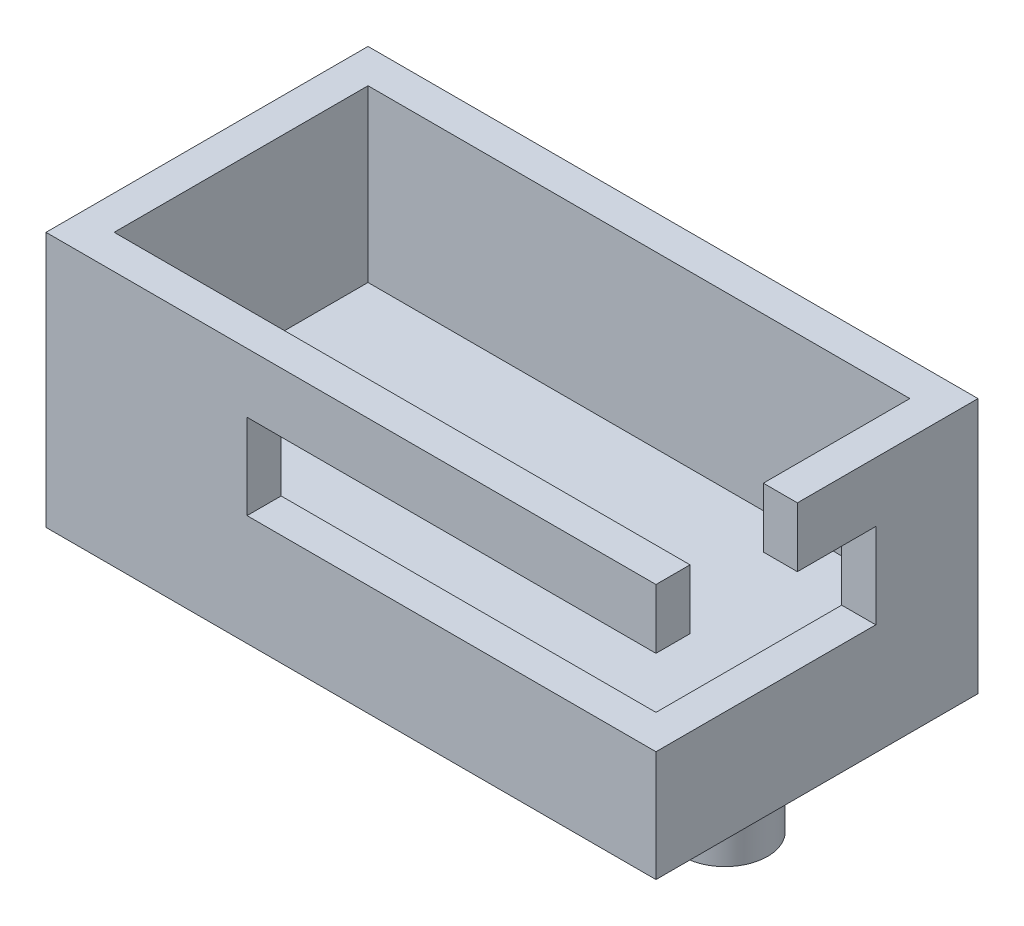
ISO-10303-21;
HEADER;
FILE_DESCRIPTION(('STEP AP214'),'2;1');
FILE_NAME('part.step','',(''),(''),'','','');
FILE_SCHEMA(('AUTOMOTIVE_DESIGN { 1 0 10303 214 1 1 1 1 }'));
ENDSEC;
DATA;
#1=APPLICATION_CONTEXT('core data for automotive mechanical design processes');
#2=APPLICATION_PROTOCOL_DEFINITION('international standard','automotive_design',2000,#1);
#3=PRODUCT_CONTEXT('',#1,'mechanical');
#4=PRODUCT('Part','Part','',(#3));
#5=PRODUCT_RELATED_PRODUCT_CATEGORY('part','',(#4));
#6=PRODUCT_DEFINITION_FORMATION('','',#4);
#7=PRODUCT_DEFINITION_CONTEXT('part definition',#1,'design');
#8=PRODUCT_DEFINITION('design','',#6,#7);
#9=PRODUCT_DEFINITION_SHAPE('','',#8);
#10=(LENGTH_UNIT() NAMED_UNIT(*) SI_UNIT(.MILLI.,.METRE.));
#11=(NAMED_UNIT(*) PLANE_ANGLE_UNIT() SI_UNIT($,.RADIAN.));
#12=(NAMED_UNIT(*) SI_UNIT($,.STERADIAN.) SOLID_ANGLE_UNIT());
#13=UNCERTAINTY_MEASURE_WITH_UNIT(LENGTH_MEASURE(1.E-05),#10,'distance_accuracy_value','');
#14=(GEOMETRIC_REPRESENTATION_CONTEXT(3) GLOBAL_UNCERTAINTY_ASSIGNED_CONTEXT((#13)) GLOBAL_UNIT_ASSIGNED_CONTEXT((#10,
#11,#12)) REPRESENTATION_CONTEXT('',''));
#15=CARTESIAN_POINT('',(0.,0.,0.));
#16=DIRECTION('',(0.,0.,1.));
#17=DIRECTION('',(1.,0.,0.));
#18=AXIS2_PLACEMENT_3D('',#15,#16,#17);
#19=CARTESIAN_POINT('',(33.8,10.,2.));
#20=DIRECTION('',(-1.,0.,0.));
#21=DIRECTION('',(0.,0.,1.));
#22=AXIS2_PLACEMENT_3D('',#19,#20,#21);
#23=PLANE('',#22);
#24=DIRECTION('',(0.,0.,-1.));
#25=VECTOR('',#24,1.);
#26=CARTESIAN_POINT('',(33.8,10.,2.));
#27=LINE('',#26,#25);
#28=CARTESIAN_POINT('',(33.8,10.,-6.30000000000001));
#29=VERTEX_POINT('',#28);
#30=CARTESIAN_POINT('',(33.8,10.,-16.9));
#31=VERTEX_POINT('',#30);
#32=EDGE_CURVE('E187',#29,#31,#27,.T.);
#33=ORIENTED_EDGE('',*,*,#32,.F.);
#34=DIRECTION('',(0.,1.,0.));
#35=VECTOR('',#34,1.);
#36=CARTESIAN_POINT('',(33.8,6.5,-6.30000000000001));
#37=LINE('',#36,#35);
#38=CARTESIAN_POINT('',(33.8,6.5,-6.30000000000001));
#39=VERTEX_POINT('',#38);
#40=EDGE_CURVE('E178',#39,#29,#37,.T.);
#41=ORIENTED_EDGE('',*,*,#40,.F.);
#42=DIRECTION('',(0.,0.,1.));
#43=VECTOR('',#42,1.);
#44=CARTESIAN_POINT('',(33.8,6.5,-41.4153013442625));
#45=LINE('',#44,#43);
#46=CARTESIAN_POINT('',(33.8,6.5,-10.9));
#47=VERTEX_POINT('',#46);
#48=EDGE_CURVE('E266',#47,#39,#45,.T.);
#49=ORIENTED_EDGE('',*,*,#48,.F.);
#50=DIRECTION('',(0.,-1.,0.));
#51=VECTOR('',#50,1.);
#52=CARTESIAN_POINT('',(33.8,6.5,-10.9));
#53=LINE('',#52,#51);
#54=CARTESIAN_POINT('',(33.8,1.5,-10.9));
#55=VERTEX_POINT('',#54);
#56=EDGE_CURVE('E250',#47,#55,#53,.T.);
#57=ORIENTED_EDGE('',*,*,#56,.T.);
#58=DIRECTION('',(0.,0.,1.));
#59=VECTOR('',#58,1.);
#60=CARTESIAN_POINT('',(33.8,1.5,-41.4153013442625));
#61=LINE('',#60,#59);
#62=CARTESIAN_POINT('',(33.8,1.5,2.));
#63=VERTEX_POINT('',#62);
#64=EDGE_CURVE('E269',#55,#63,#61,.T.);
#65=ORIENTED_EDGE('',*,*,#64,.T.);
#66=DIRECTION('',(0.,-1.,0.));
#67=VECTOR('',#66,1.);
#68=CARTESIAN_POINT('',(33.8,10.,2.));
#69=LINE('',#68,#67);
#70=CARTESIAN_POINT('',(33.8,-5.,2.));
#71=VERTEX_POINT('',#70);
#72=EDGE_CURVE('E201',#63,#71,#69,.T.);
#73=ORIENTED_EDGE('',*,*,#72,.T.);
#74=DIRECTION('',(0.,0.,-1.));
#75=VECTOR('',#74,1.);
#76=CARTESIAN_POINT('',(33.8,-5.,0.));
#77=LINE('',#76,#75);
#78=CARTESIAN_POINT('',(33.8,-5.,-16.9));
#79=VERTEX_POINT('',#78);
#80=EDGE_CURVE('E284',#71,#79,#77,.T.);
#81=ORIENTED_EDGE('',*,*,#80,.T.);
#82=DIRECTION('',(0.,-1.,0.));
#83=VECTOR('',#82,1.);
#84=CARTESIAN_POINT('',(33.8,10.,-16.9));
#85=LINE('',#84,#83);
#86=EDGE_CURVE('E199',#31,#79,#85,.T.);
#87=ORIENTED_EDGE('',*,*,#86,.F.);
#88=EDGE_LOOP('',(#33,#41,#49,#57,#65,#73,#81,#87));
#89=FACE_BOUND('',#88,.T.);
#90=ADVANCED_FACE('F45',(#89),#23,.F.);
#91=CARTESIAN_POINT('',(9.8,6.5,-41.4153013442625));
#92=DIRECTION('',(0.,1.,0.));
#93=DIRECTION('',(-1.,0.,0.));
#94=AXIS2_PLACEMENT_3D('',#91,#92,#93);
#95=PLANE('',#94);
#96=ORIENTED_EDGE('',*,*,#48,.T.);
#97=DIRECTION('',(1.,0.,0.));
#98=VECTOR('',#97,1.);
#99=CARTESIAN_POINT('',(24.5930589013091,6.5,-6.30000000000001));
#100=LINE('',#99,#98);
#101=CARTESIAN_POINT('',(31.8,6.5,-6.30000000000001));
#102=VERTEX_POINT('',#101);
#103=EDGE_CURVE('E243',#102,#39,#100,.T.);
#104=ORIENTED_EDGE('',*,*,#103,.F.);
#105=DIRECTION('',(0.,0.,-1.));
#106=VECTOR('',#105,1.);
#107=CARTESIAN_POINT('',(31.8,6.5,0.));
#108=LINE('',#107,#106);
#109=CARTESIAN_POINT('',(31.8,6.5,-10.9));
#110=VERTEX_POINT('',#109);
#111=EDGE_CURVE('E209',#102,#110,#108,.T.);
#112=ORIENTED_EDGE('',*,*,#111,.T.);
#113=DIRECTION('',(1.,0.,0.));
#114=VECTOR('',#113,1.);
#115=CARTESIAN_POINT('',(9.8,6.5,-10.9));
#116=LINE('',#115,#114);
#117=EDGE_CURVE('E253',#110,#47,#116,.T.);
#118=ORIENTED_EDGE('',*,*,#117,.T.);
#119=EDGE_LOOP('',(#96,#104,#112,#118));
#120=FACE_BOUND('',#119,.T.);
#121=ADVANCED_FACE('F331',(#120),#95,.F.);
#122=CARTESIAN_POINT('',(0.,10.,0.));
#123=DIRECTION('',(0.,1.,0.));
#124=DIRECTION('',(0.,0.,1.));
#125=AXIS2_PLACEMENT_3D('',#122,#123,#124);
#126=PLANE('',#125);
#127=DIRECTION('',(1.,0.,0.));
#128=VECTOR('',#127,1.);
#129=CARTESIAN_POINT('',(24.5930589013091,10.,-6.30000000000001));
#130=LINE('',#129,#128);
#131=CARTESIAN_POINT('',(31.8,10.,-6.30000000000001));
#132=VERTEX_POINT('',#131);
#133=EDGE_CURVE('E246',#132,#29,#130,.T.);
#134=ORIENTED_EDGE('',*,*,#133,.T.);
#135=ORIENTED_EDGE('',*,*,#32,.T.);
#136=DIRECTION('',(-1.,0.,0.));
#137=VECTOR('',#136,1.);
#138=CARTESIAN_POINT('',(-2.,10.,-16.9));
#139=LINE('',#138,#137);
#140=CARTESIAN_POINT('',(-2.,10.,-16.9));
#141=VERTEX_POINT('',#140);
#142=EDGE_CURVE('E186',#31,#141,#139,.T.);
#143=ORIENTED_EDGE('',*,*,#142,.T.);
#144=DIRECTION('',(0.,0.,1.));
#145=VECTOR('',#144,1.);
#146=CARTESIAN_POINT('',(-2.,10.,2.));
#147=LINE('',#146,#145);
#148=CARTESIAN_POINT('',(-2.,10.,2.));
#149=VERTEX_POINT('',#148);
#150=EDGE_CURVE('E189',#141,#149,#147,.T.);
#151=ORIENTED_EDGE('',*,*,#150,.T.);
#152=DIRECTION('',(1.,0.,0.));
#153=VECTOR('',#152,1.);
#154=CARTESIAN_POINT('',(-2.,10.,2.));
#155=LINE('',#154,#153);
#156=CARTESIAN_POINT('',(33.8,10.,2.));
#157=VERTEX_POINT('',#156);
#158=EDGE_CURVE('E184',#149,#157,#155,.T.);
#159=ORIENTED_EDGE('',*,*,#158,.T.);
#160=CARTESIAN_POINT('',(33.8,10.,0.));
#161=VERTEX_POINT('',#160);
#162=EDGE_CURVE('E175',#157,#161,#27,.T.);
#163=ORIENTED_EDGE('',*,*,#162,.T.);
#164=DIRECTION('',(1.,0.,0.));
#165=VECTOR('',#164,1.);
#166=CARTESIAN_POINT('',(0.,10.,0.));
#167=LINE('',#166,#165);
#168=CARTESIAN_POINT('',(0.,10.,0.));
#169=VERTEX_POINT('',#168);
#170=EDGE_CURVE('E159',#169,#161,#167,.T.);
#171=ORIENTED_EDGE('',*,*,#170,.F.);
#172=DIRECTION('',(0.,0.,1.));
#173=VECTOR('',#172,1.);
#174=CARTESIAN_POINT('',(0.,10.,0.));
#175=LINE('',#174,#173);
#176=CARTESIAN_POINT('',(0.,10.,-14.9));
#177=VERTEX_POINT('',#176);
#178=EDGE_CURVE('E170',#177,#169,#175,.T.);
#179=ORIENTED_EDGE('',*,*,#178,.F.);
#180=DIRECTION('',(-1.,0.,0.));
#181=VECTOR('',#180,1.);
#182=CARTESIAN_POINT('',(0.,10.,-14.9));
#183=LINE('',#182,#181);
#184=CARTESIAN_POINT('',(31.8,10.,-14.9));
#185=VERTEX_POINT('',#184);
#186=EDGE_CURVE('E294',#185,#177,#183,.T.);
#187=ORIENTED_EDGE('',*,*,#186,.F.);
#188=DIRECTION('',(0.,0.,-1.));
#189=VECTOR('',#188,1.);
#190=CARTESIAN_POINT('',(31.8,10.,0.));
#191=LINE('',#190,#189);
#192=EDGE_CURVE('E169',#132,#185,#191,.T.);
#193=ORIENTED_EDGE('',*,*,#192,.F.);
#194=EDGE_LOOP('',(#134,#135,#143,#151,#159,#163,#171,#179,#187,#193));
#195=FACE_BOUND('',#194,.T.);
#196=ADVANCED_FACE('F182',(#195),#126,.T.);
#197=CARTESIAN_POINT('',(-2.,10.,2.));
#198=DIRECTION('',(0.,0.,-1.));
#199=DIRECTION('',(-1.,0.,0.));
#200=AXIS2_PLACEMENT_3D('',#197,#198,#199);
#201=PLANE('',#200);
#202=DIRECTION('',(0.,-1.,0.));
#203=VECTOR('',#202,1.);
#204=CARTESIAN_POINT('',(9.8,6.5,2.));
#205=LINE('',#204,#203);
#206=CARTESIAN_POINT('',(9.8,6.5,2.));
#207=VERTEX_POINT('',#206);
#208=CARTESIAN_POINT('',(9.8,1.5,2.));
#209=VERTEX_POINT('',#208);
#210=EDGE_CURVE('E248',#207,#209,#205,.T.);
#211=ORIENTED_EDGE('',*,*,#210,.F.);
#212=DIRECTION('',(-1.,0.,0.));
#213=VECTOR('',#212,1.);
#214=CARTESIAN_POINT('',(9.8,6.5,2.));
#215=LINE('',#214,#213);
#216=CARTESIAN_POINT('',(33.8,6.5,2.));
#217=VERTEX_POINT('',#216);
#218=EDGE_CURVE('E261',#217,#207,#215,.T.);
#219=ORIENTED_EDGE('',*,*,#218,.F.);
#220=EDGE_CURVE('E202',#157,#217,#69,.T.);
#221=ORIENTED_EDGE('',*,*,#220,.F.);
#222=ORIENTED_EDGE('',*,*,#158,.F.);
#223=DIRECTION('',(0.,-1.,0.));
#224=VECTOR('',#223,1.);
#225=CARTESIAN_POINT('',(-2.,10.,2.));
#226=LINE('',#225,#224);
#227=CARTESIAN_POINT('',(-2.,-5.,2.));
#228=VERTEX_POINT('',#227);
#229=EDGE_CURVE('E195',#149,#228,#226,.T.);
#230=ORIENTED_EDGE('',*,*,#229,.T.);
#231=DIRECTION('',(1.,0.,0.));
#232=VECTOR('',#231,1.);
#233=CARTESIAN_POINT('',(0.,-5.,2.));
#234=LINE('',#233,#232);
#235=EDGE_CURVE('E281',#228,#71,#234,.T.);
#236=ORIENTED_EDGE('',*,*,#235,.T.);
#237=ORIENTED_EDGE('',*,*,#72,.F.);
#238=DIRECTION('',(1.,0.,0.));
#239=VECTOR('',#238,1.);
#240=CARTESIAN_POINT('',(9.8,1.5,2.));
#241=LINE('',#240,#239);
#242=EDGE_CURVE('E259',#209,#63,#241,.T.);
#243=ORIENTED_EDGE('',*,*,#242,.F.);
#244=EDGE_LOOP('',(#211,#219,#221,#222,#230,#236,#237,#243));
#245=FACE_BOUND('',#244,.T.);
#246=ADVANCED_FACE('F365',(#245),#201,.F.);
#247=CARTESIAN_POINT('',(33.8,6.5,0.));
#248=VERTEX_POINT('',#247);
#249=EDGE_CURVE('E177',#248,#217,#45,.T.);
#250=ORIENTED_EDGE('',*,*,#249,.F.);
#251=DIRECTION('',(0.,-1.,0.));
#252=VECTOR('',#251,1.);
#253=CARTESIAN_POINT('',(33.8,6.5,0.));
#254=LINE('',#253,#252);
#255=EDGE_CURVE('E162',#161,#248,#254,.T.);
#256=ORIENTED_EDGE('',*,*,#255,.F.);
#257=ORIENTED_EDGE('',*,*,#162,.F.);
#258=ORIENTED_EDGE('',*,*,#220,.T.);
#259=EDGE_LOOP('',(#250,#256,#257,#258));
#260=FACE_BOUND('',#259,.T.);
#261=ADVANCED_FACE('F173',(#260),#23,.F.);
#262=CARTESIAN_POINT('',(-2.,10.,-16.9));
#263=DIRECTION('',(0.,0.,1.));
#264=DIRECTION('',(1.,0.,0.));
#265=AXIS2_PLACEMENT_3D('',#262,#263,#264);
#266=PLANE('',#265);
#267=ORIENTED_EDGE('',*,*,#86,.T.);
#268=DIRECTION('',(1.,0.,0.));
#269=VECTOR('',#268,1.);
#270=CARTESIAN_POINT('',(0.,-5.,-16.9));
#271=LINE('',#270,#269);
#272=CARTESIAN_POINT('',(-2.,-5.,-16.9));
#273=VERTEX_POINT('',#272);
#274=EDGE_CURVE('E287',#273,#79,#271,.T.);
#275=ORIENTED_EDGE('',*,*,#274,.F.);
#276=DIRECTION('',(0.,-1.,0.));
#277=VECTOR('',#276,1.);
#278=CARTESIAN_POINT('',(-2.,10.,-16.9));
#279=LINE('',#278,#277);
#280=EDGE_CURVE('E197',#141,#273,#279,.T.);
#281=ORIENTED_EDGE('',*,*,#280,.F.);
#282=ORIENTED_EDGE('',*,*,#142,.F.);
#283=EDGE_LOOP('',(#267,#275,#281,#282));
#284=FACE_BOUND('',#283,.T.);
#285=ADVANCED_FACE('F364',(#284),#266,.F.);
#286=CARTESIAN_POINT('',(-2.,10.,2.));
#287=DIRECTION('',(1.,0.,0.));
#288=DIRECTION('',(0.,0.,-1.));
#289=AXIS2_PLACEMENT_3D('',#286,#287,#288);
#290=PLANE('',#289);
#291=ORIENTED_EDGE('',*,*,#280,.T.);
#292=DIRECTION('',(0.,0.,-1.));
#293=VECTOR('',#292,1.);
#294=CARTESIAN_POINT('',(-2.,-5.,0.));
#295=LINE('',#294,#293);
#296=EDGE_CURVE('E278',#228,#273,#295,.T.);
#297=ORIENTED_EDGE('',*,*,#296,.F.);
#298=ORIENTED_EDGE('',*,*,#229,.F.);
#299=ORIENTED_EDGE('',*,*,#150,.F.);
#300=EDGE_LOOP('',(#291,#297,#298,#299));
#301=FACE_BOUND('',#300,.T.);
#302=ADVANCED_FACE('F371',(#301),#290,.F.);
#303=CARTESIAN_POINT('',(0.,10.,0.));
#304=DIRECTION('',(1.,0.,0.));
#305=DIRECTION('',(0.,0.,-1.));
#306=AXIS2_PLACEMENT_3D('',#303,#304,#305);
#307=PLANE('',#306);
#308=DIRECTION('',(0.,0.,1.));
#309=VECTOR('',#308,1.);
#310=CARTESIAN_POINT('',(0.,0.,0.));
#311=LINE('',#310,#309);
#312=CARTESIAN_POINT('',(0.,0.,-14.9));
#313=VERTEX_POINT('',#312);
#314=CARTESIAN_POINT('',(0.,0.,0.));
#315=VERTEX_POINT('',#314);
#316=EDGE_CURVE('E290',#313,#315,#311,.T.);
#317=ORIENTED_EDGE('',*,*,#316,.F.);
#318=DIRECTION('',(0.,-1.,0.));
#319=VECTOR('',#318,1.);
#320=CARTESIAN_POINT('',(0.,10.,-14.9));
#321=LINE('',#320,#319);
#322=EDGE_CURVE('E296',#177,#313,#321,.T.);
#323=ORIENTED_EDGE('',*,*,#322,.F.);
#324=ORIENTED_EDGE('',*,*,#178,.T.);
#325=DIRECTION('',(0.,-1.,0.));
#326=VECTOR('',#325,1.);
#327=CARTESIAN_POINT('',(0.,10.,0.));
#328=LINE('',#327,#326);
#329=EDGE_CURVE('E165',#169,#315,#328,.T.);
#330=ORIENTED_EDGE('',*,*,#329,.T.);
#331=EDGE_LOOP('',(#317,#323,#324,#330));
#332=FACE_BOUND('',#331,.T.);
#333=ADVANCED_FACE('F313',(#332),#307,.T.);
#334=CARTESIAN_POINT('',(0.,10.,0.));
#335=DIRECTION('',(0.,0.,-1.));
#336=DIRECTION('',(-1.,0.,0.));
#337=AXIS2_PLACEMENT_3D('',#334,#335,#336);
#338=PLANE('',#337);
#339=DIRECTION('',(1.,0.,0.));
#340=VECTOR('',#339,1.);
#341=CARTESIAN_POINT('',(0.,6.5,0.));
#342=LINE('',#341,#340);
#343=CARTESIAN_POINT('',(9.8,6.5,0.));
#344=VERTEX_POINT('',#343);
#345=EDGE_CURVE('E60',#344,#248,#342,.T.);
#346=ORIENTED_EDGE('',*,*,#345,.F.);
#347=DIRECTION('',(0.,1.,0.));
#348=VECTOR('',#347,1.);
#349=CARTESIAN_POINT('',(9.8,10.,0.));
#350=LINE('',#349,#348);
#351=CARTESIAN_POINT('',(9.8,1.5,0.));
#352=VERTEX_POINT('',#351);
#353=EDGE_CURVE('E211',#352,#344,#350,.T.);
#354=ORIENTED_EDGE('',*,*,#353,.F.);
#355=DIRECTION('',(-1.,0.,0.));
#356=VECTOR('',#355,1.);
#357=CARTESIAN_POINT('',(0.,1.5,0.));
#358=LINE('',#357,#356);
#359=CARTESIAN_POINT('',(31.8,1.5,0.));
#360=VERTEX_POINT('',#359);
#361=EDGE_CURVE('E275',#360,#352,#358,.T.);
#362=ORIENTED_EDGE('',*,*,#361,.F.);
#363=DIRECTION('',(0.,-1.,0.));
#364=VECTOR('',#363,1.);
#365=CARTESIAN_POINT('',(31.8,10.,0.));
#366=LINE('',#365,#364);
#367=CARTESIAN_POINT('',(31.8,0.,0.));
#368=VERTEX_POINT('',#367);
#369=EDGE_CURVE('E310',#360,#368,#366,.T.);
#370=ORIENTED_EDGE('',*,*,#369,.T.);
#371=DIRECTION('',(1.,0.,0.));
#372=VECTOR('',#371,1.);
#373=CARTESIAN_POINT('',(0.,0.,0.));
#374=LINE('',#373,#372);
#375=EDGE_CURVE('E299',#315,#368,#374,.T.);
#376=ORIENTED_EDGE('',*,*,#375,.F.);
#377=ORIENTED_EDGE('',*,*,#329,.F.);
#378=ORIENTED_EDGE('',*,*,#170,.T.);
#379=ORIENTED_EDGE('',*,*,#255,.T.);
#380=EDGE_LOOP('',(#346,#354,#362,#370,#376,#377,#378,#379));
#381=FACE_BOUND('',#380,.T.);
#382=ADVANCED_FACE('F161',(#381),#338,.T.);
#383=CARTESIAN_POINT('',(31.8,10.,0.));
#384=DIRECTION('',(-1.,0.,0.));
#385=DIRECTION('',(0.,0.,1.));
#386=AXIS2_PLACEMENT_3D('',#383,#384,#385);
#387=PLANE('',#386);
#388=DIRECTION('',(0.,1.,0.));
#389=VECTOR('',#388,1.);
#390=CARTESIAN_POINT('',(31.8,6.5,-6.30000000000001));
#391=LINE('',#390,#389);
#392=EDGE_CURVE('E68',#102,#132,#391,.T.);
#393=ORIENTED_EDGE('',*,*,#392,.T.);
#394=ORIENTED_EDGE('',*,*,#192,.T.);
#395=DIRECTION('',(0.,-1.,0.));
#396=VECTOR('',#395,1.);
#397=CARTESIAN_POINT('',(31.8,10.,-14.9));
#398=LINE('',#397,#396);
#399=CARTESIAN_POINT('',(31.8,0.,-14.9));
#400=VERTEX_POINT('',#399);
#401=EDGE_CURVE('E308',#185,#400,#398,.T.);
#402=ORIENTED_EDGE('',*,*,#401,.T.);
#403=DIRECTION('',(0.,0.,-1.));
#404=VECTOR('',#403,1.);
#405=CARTESIAN_POINT('',(31.8,0.,0.));
#406=LINE('',#405,#404);
#407=EDGE_CURVE('E302',#368,#400,#406,.T.);
#408=ORIENTED_EDGE('',*,*,#407,.F.);
#409=ORIENTED_EDGE('',*,*,#369,.F.);
#410=DIRECTION('',(0.,0.,1.));
#411=VECTOR('',#410,1.);
#412=CARTESIAN_POINT('',(31.8,1.5,0.));
#413=LINE('',#412,#411);
#414=CARTESIAN_POINT('',(31.8,1.5,-10.9));
#415=VERTEX_POINT('',#414);
#416=EDGE_CURVE('E207',#415,#360,#413,.T.);
#417=ORIENTED_EDGE('',*,*,#416,.F.);
#418=DIRECTION('',(0.,1.,0.));
#419=VECTOR('',#418,1.);
#420=CARTESIAN_POINT('',(31.8,10.,-10.9));
#421=LINE('',#420,#419);
#422=EDGE_CURVE('E204',#415,#110,#421,.T.);
#423=ORIENTED_EDGE('',*,*,#422,.T.);
#424=ORIENTED_EDGE('',*,*,#111,.F.);
#425=EDGE_LOOP('',(#393,#394,#402,#408,#409,#417,#423,#424));
#426=FACE_BOUND('',#425,.T.);
#427=ADVANCED_FACE('F326',(#426),#387,.T.);
#428=CARTESIAN_POINT('',(0.,10.,-14.9));
#429=DIRECTION('',(0.,0.,1.));
#430=DIRECTION('',(1.,0.,0.));
#431=AXIS2_PLACEMENT_3D('',#428,#429,#430);
#432=PLANE('',#431);
#433=DIRECTION('',(-1.,0.,0.));
#434=VECTOR('',#433,1.);
#435=CARTESIAN_POINT('',(0.,0.,-14.9));
#436=LINE('',#435,#434);
#437=EDGE_CURVE('E291',#400,#313,#436,.T.);
#438=ORIENTED_EDGE('',*,*,#437,.F.);
#439=ORIENTED_EDGE('',*,*,#401,.F.);
#440=ORIENTED_EDGE('',*,*,#186,.T.);
#441=ORIENTED_EDGE('',*,*,#322,.T.);
#442=EDGE_LOOP('',(#438,#439,#440,#441));
#443=FACE_BOUND('',#442,.T.);
#444=ADVANCED_FACE('F321',(#443),#432,.T.);
#445=CARTESIAN_POINT('',(0.,0.,0.));
#446=DIRECTION('',(0.,1.,0.));
#447=DIRECTION('',(0.,0.,1.));
#448=AXIS2_PLACEMENT_3D('',#445,#446,#447);
#449=PLANE('',#448);
#450=ORIENTED_EDGE('',*,*,#437,.T.);
#451=ORIENTED_EDGE('',*,*,#316,.T.);
#452=ORIENTED_EDGE('',*,*,#375,.T.);
#453=ORIENTED_EDGE('',*,*,#407,.T.);
#454=EDGE_LOOP('',(#450,#451,#452,#453));
#455=FACE_BOUND('',#454,.T.);
#456=ADVANCED_FACE('F316',(#455),#449,.T.);
#457=CARTESIAN_POINT('',(0.,-5.,0.));
#458=DIRECTION('',(0.,1.,0.));
#459=DIRECTION('',(0.,0.,1.));
#460=AXIS2_PLACEMENT_3D('',#457,#458,#459);
#461=PLANE('',#460);
#462=CARTESIAN_POINT('',(28.4,-5.,-7.44999999999999));
#463=DIRECTION('',(0.,1.,0.));
#464=DIRECTION('',(0.,0.,1.));
#465=AXIS2_PLACEMENT_3D('',#462,#463,#464);
#466=CIRCLE('',#465,2.9);
#467=CARTESIAN_POINT('',(28.4,-5.,-4.55));
#468=VERTEX_POINT('',#467);
#469=EDGE_CURVE('E53',#468,#468,#466,.T.);
#470=ORIENTED_EDGE('',*,*,#469,.T.);
#471=EDGE_LOOP('',(#470));
#472=FACE_BOUND('',#471,.T.);
#473=CARTESIAN_POINT('',(3.4,-5.,-7.45));
#474=DIRECTION('',(0.,1.,0.));
#475=DIRECTION('',(0.,0.,1.));
#476=AXIS2_PLACEMENT_3D('',#473,#474,#475);
#477=CIRCLE('',#476,2.9);
#478=CARTESIAN_POINT('',(3.4,-5.,-4.55));
#479=VERTEX_POINT('',#478);
#480=EDGE_CURVE('E216',#479,#479,#477,.T.);
#481=ORIENTED_EDGE('',*,*,#480,.T.);
#482=EDGE_LOOP('',(#481));
#483=FACE_BOUND('',#482,.T.);
#484=ORIENTED_EDGE('',*,*,#296,.T.);
#485=ORIENTED_EDGE('',*,*,#274,.T.);
#486=ORIENTED_EDGE('',*,*,#80,.F.);
#487=ORIENTED_EDGE('',*,*,#235,.F.);
#488=EDGE_LOOP('',(#484,#485,#486,#487));
#489=FACE_BOUND('',#488,.T.);
#490=ADVANCED_FACE('F221',(#472,#483,#489),#461,.F.);
#491=CARTESIAN_POINT('',(9.8,6.5,-41.4153013442625));
#492=DIRECTION('',(-1.,0.,0.));
#493=DIRECTION('',(0.,-1.,0.));
#494=AXIS2_PLACEMENT_3D('',#491,#492,#493);
#495=PLANE('',#494);
#496=ORIENTED_EDGE('',*,*,#353,.T.);
#497=DIRECTION('',(0.,0.,1.));
#498=VECTOR('',#497,1.);
#499=CARTESIAN_POINT('',(9.8,6.5,-41.4153013442625));
#500=LINE('',#499,#498);
#501=EDGE_CURVE('E254',#344,#207,#500,.T.);
#502=ORIENTED_EDGE('',*,*,#501,.T.);
#503=ORIENTED_EDGE('',*,*,#210,.T.);
#504=DIRECTION('',(0.,0.,1.));
#505=VECTOR('',#504,1.);
#506=CARTESIAN_POINT('',(9.8,1.5,-41.4153013442625));
#507=LINE('',#506,#505);
#508=EDGE_CURVE('E264',#352,#209,#507,.T.);
#509=ORIENTED_EDGE('',*,*,#508,.F.);
#510=EDGE_LOOP('',(#496,#502,#503,#509));
#511=FACE_BOUND('',#510,.T.);
#512=ADVANCED_FACE('F386',(#511),#495,.F.);
#513=ORIENTED_EDGE('',*,*,#345,.T.);
#514=ORIENTED_EDGE('',*,*,#249,.T.);
#515=ORIENTED_EDGE('',*,*,#218,.T.);
#516=ORIENTED_EDGE('',*,*,#501,.F.);
#517=EDGE_LOOP('',(#513,#514,#515,#516));
#518=FACE_BOUND('',#517,.T.);
#519=ADVANCED_FACE('F360',(#518),#95,.F.);
#520=CARTESIAN_POINT('',(9.8,1.5,-41.4153013442625));
#521=DIRECTION('',(0.,-1.,0.));
#522=DIRECTION('',(0.,0.,-1.));
#523=AXIS2_PLACEMENT_3D('',#520,#521,#522);
#524=PLANE('',#523);
#525=ORIENTED_EDGE('',*,*,#361,.T.);
#526=ORIENTED_EDGE('',*,*,#508,.T.);
#527=ORIENTED_EDGE('',*,*,#242,.T.);
#528=ORIENTED_EDGE('',*,*,#64,.F.);
#529=DIRECTION('',(-1.,0.,0.));
#530=VECTOR('',#529,1.);
#531=CARTESIAN_POINT('',(9.8,1.5,-10.9));
#532=LINE('',#531,#530);
#533=EDGE_CURVE('E256',#55,#415,#532,.T.);
#534=ORIENTED_EDGE('',*,*,#533,.T.);
#535=ORIENTED_EDGE('',*,*,#416,.T.);
#536=EDGE_LOOP('',(#525,#526,#527,#528,#534,#535));
#537=FACE_BOUND('',#536,.T.);
#538=ADVANCED_FACE('F352',(#537),#524,.F.);
#539=CARTESIAN_POINT('',(-2.,10.,-10.9));
#540=DIRECTION('',(0.,0.,1.));
#541=DIRECTION('',(1.,0.,0.));
#542=AXIS2_PLACEMENT_3D('',#539,#540,#541);
#543=PLANE('',#542);
#544=ORIENTED_EDGE('',*,*,#533,.F.);
#545=ORIENTED_EDGE('',*,*,#56,.F.);
#546=ORIENTED_EDGE('',*,*,#117,.F.);
#547=ORIENTED_EDGE('',*,*,#422,.F.);
#548=EDGE_LOOP('',(#544,#545,#546,#547));
#549=FACE_BOUND('',#548,.T.);
#550=ADVANCED_FACE('F334',(#549),#543,.T.);
#551=CARTESIAN_POINT('',(24.5930589013091,6.5,-6.30000000000001));
#552=DIRECTION('',(0.,0.,-1.));
#553=DIRECTION('',(-1.,0.,0.));
#554=AXIS2_PLACEMENT_3D('',#551,#552,#553);
#555=PLANE('',#554);
#556=ORIENTED_EDGE('',*,*,#103,.T.);
#557=ORIENTED_EDGE('',*,*,#40,.T.);
#558=ORIENTED_EDGE('',*,*,#133,.F.);
#559=ORIENTED_EDGE('',*,*,#392,.F.);
#560=EDGE_LOOP('',(#556,#557,#558,#559));
#561=FACE_BOUND('',#560,.T.);
#562=ADVANCED_FACE('F340',(#561),#555,.F.);
#563=CARTESIAN_POINT('',(3.4,-10.,-7.45));
#564=DIRECTION('',(0.,1.,0.));
#565=DIRECTION('',(0.,0.,1.));
#566=AXIS2_PLACEMENT_3D('',#563,#564,#565);
#567=CYLINDRICAL_SURFACE('',#566,2.5);
#568=CARTESIAN_POINT('',(3.4,-5.4,-7.45));
#569=DIRECTION('',(0.,1.,0.));
#570=DIRECTION('',(0.,0.,1.));
#571=AXIS2_PLACEMENT_3D('',#568,#569,#570);
#572=CIRCLE('',#571,2.5);
#573=CARTESIAN_POINT('',(3.4,-5.4,-4.95));
#574=VERTEX_POINT('',#573);
#575=EDGE_CURVE('E12',#574,#574,#572,.F.);
#576=ORIENTED_EDGE('',*,*,#575,.T.);
#577=EDGE_LOOP('',(#576));
#578=FACE_BOUND('',#577,.T.);
#579=CARTESIAN_POINT('',(3.4,-10.,-7.45));
#580=DIRECTION('',(0.,-1.,0.));
#581=DIRECTION('',(0.,0.,-1.));
#582=AXIS2_PLACEMENT_3D('',#579,#580,#581);
#583=CIRCLE('',#582,2.5);
#584=CARTESIAN_POINT('',(3.4,-10.,-9.95));
#585=VERTEX_POINT('',#584);
#586=EDGE_CURVE('E179',#585,#585,#583,.T.);
#587=ORIENTED_EDGE('',*,*,#586,.F.);
#588=EDGE_LOOP('',(#587));
#589=FACE_BOUND('',#588,.T.);
#590=ADVANCED_FACE('F342',(#578,#589),#567,.T.);
#591=CARTESIAN_POINT('',(3.4,-10.,-7.45));
#592=DIRECTION('',(0.,-1.,0.));
#593=DIRECTION('',(0.,0.,-1.));
#594=AXIS2_PLACEMENT_3D('',#591,#592,#593);
#595=PLANE('',#594);
#596=ORIENTED_EDGE('',*,*,#586,.T.);
#597=EDGE_LOOP('',(#596));
#598=FACE_BOUND('',#597,.T.);
#599=ADVANCED_FACE('F233',(#598),#595,.T.);
#600=CARTESIAN_POINT('',(28.4,-10.,-7.44999999999999));
#601=DIRECTION('',(0.,1.,0.));
#602=DIRECTION('',(0.,0.,1.));
#603=AXIS2_PLACEMENT_3D('',#600,#601,#602);
#604=CYLINDRICAL_SURFACE('',#603,2.5);
#605=CARTESIAN_POINT('',(28.4,-5.4,-7.44999999999999));
#606=DIRECTION('',(0.,1.,0.));
#607=DIRECTION('',(0.,0.,1.));
#608=AXIS2_PLACEMENT_3D('',#605,#606,#607);
#609=CIRCLE('',#608,2.5);
#610=CARTESIAN_POINT('',(28.4,-5.4,-4.95));
#611=VERTEX_POINT('',#610);
#612=EDGE_CURVE('E213',#611,#611,#609,.F.);
#613=ORIENTED_EDGE('',*,*,#612,.T.);
#614=EDGE_LOOP('',(#613));
#615=FACE_BOUND('',#614,.T.);
#616=CARTESIAN_POINT('',(28.4,-10.,-7.44999999999999));
#617=DIRECTION('',(0.,-1.,0.));
#618=DIRECTION('',(0.,0.,1.));
#619=AXIS2_PLACEMENT_3D('',#616,#617,#618);
#620=CIRCLE('',#619,2.5);
#621=CARTESIAN_POINT('',(28.4,-10.,-4.95));
#622=VERTEX_POINT('',#621);
#623=EDGE_CURVE('E237',#622,#622,#620,.T.);
#624=ORIENTED_EDGE('',*,*,#623,.F.);
#625=EDGE_LOOP('',(#624));
#626=FACE_BOUND('',#625,.T.);
#627=ADVANCED_FACE('F230',(#615,#626),#604,.T.);
#628=CARTESIAN_POINT('',(28.4,-10.,-7.44999999999999));
#629=DIRECTION('',(0.,1.,0.));
#630=DIRECTION('',(0.,0.,1.));
#631=AXIS2_PLACEMENT_3D('',#628,#629,#630);
#632=PLANE('',#631);
#633=ORIENTED_EDGE('',*,*,#623,.T.);
#634=EDGE_LOOP('',(#633));
#635=FACE_BOUND('',#634,.T.);
#636=ADVANCED_FACE('F227',(#635),#632,.F.);
#637=CARTESIAN_POINT('',(28.4,-5.4,-7.44999999999999));
#638=DIRECTION('',(0.,1.,0.));
#639=DIRECTION('',(0.,0.,1.));
#640=AXIS2_PLACEMENT_3D('',#637,#638,#639);
#641=TOROIDAL_SURFACE('',#640,2.9,0.4);
#642=ORIENTED_EDGE('',*,*,#469,.F.);
#643=EDGE_LOOP('',(#642));
#644=FACE_BOUND('',#643,.T.);
#645=ORIENTED_EDGE('',*,*,#612,.F.);
#646=EDGE_LOOP('',(#645));
#647=FACE_BOUND('',#646,.T.);
#648=ADVANCED_FACE('F224',(#644,#647),#641,.F.);
#649=CARTESIAN_POINT('',(3.4,-5.4,-7.45));
#650=DIRECTION('',(0.,1.,0.));
#651=DIRECTION('',(0.,0.,1.));
#652=AXIS2_PLACEMENT_3D('',#649,#650,#651);
#653=TOROIDAL_SURFACE('',#652,2.9,0.4);
#654=ORIENTED_EDGE('',*,*,#480,.F.);
#655=EDGE_LOOP('',(#654));
#656=FACE_BOUND('',#655,.T.);
#657=ORIENTED_EDGE('',*,*,#575,.F.);
#658=EDGE_LOOP('',(#657));
#659=FACE_BOUND('',#658,.T.);
#660=ADVANCED_FACE('F47',(#656,#659),#653,.F.);
#661=CLOSED_SHELL('',(#90,#121,#196,#246,#261,#285,#302,#333,#382,#427,#444,#456,#490,#512,#519,
#538,#550,#562,#590,#599,#627,#636,#648,#660));
#662=MANIFOLD_SOLID_BREP('B2',#661);
#663=ADVANCED_BREP_SHAPE_REPRESENTATION('',(#18,#662),#14);
#664=SHAPE_DEFINITION_REPRESENTATION(#9,#663);
ENDSEC;
END-ISO-10303-21;
